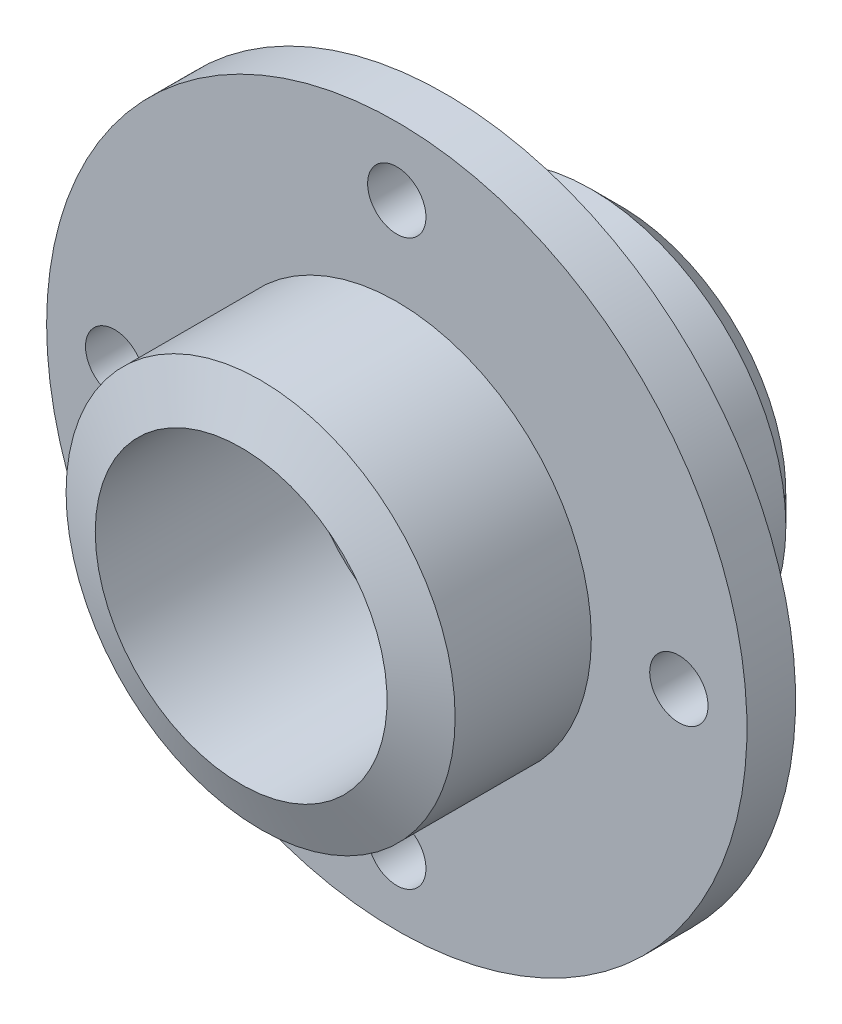
ISO-10303-21;
HEADER;
FILE_DESCRIPTION(('STEP AP214'),'2;1');
FILE_NAME('part.step','',(''),(''),'','','');
FILE_SCHEMA(('AUTOMOTIVE_DESIGN { 1 0 10303 214 1 1 1 1 }'));
ENDSEC;
DATA;
#1=APPLICATION_CONTEXT('core data for automotive mechanical design processes');
#2=APPLICATION_PROTOCOL_DEFINITION('international standard','automotive_design',2000,#1);
#3=PRODUCT_CONTEXT('',#1,'mechanical');
#4=PRODUCT('Part','Part','',(#3));
#5=PRODUCT_RELATED_PRODUCT_CATEGORY('part','',(#4));
#6=PRODUCT_DEFINITION_FORMATION('','',#4);
#7=PRODUCT_DEFINITION_CONTEXT('part definition',#1,'design');
#8=PRODUCT_DEFINITION('design','',#6,#7);
#9=PRODUCT_DEFINITION_SHAPE('','',#8);
#10=(LENGTH_UNIT() NAMED_UNIT(*) SI_UNIT(.MILLI.,.METRE.));
#11=(NAMED_UNIT(*) PLANE_ANGLE_UNIT() SI_UNIT($,.RADIAN.));
#12=(NAMED_UNIT(*) SI_UNIT($,.STERADIAN.) SOLID_ANGLE_UNIT());
#13=UNCERTAINTY_MEASURE_WITH_UNIT(LENGTH_MEASURE(1.E-05),#10,'distance_accuracy_value','');
#14=(GEOMETRIC_REPRESENTATION_CONTEXT(3) GLOBAL_UNCERTAINTY_ASSIGNED_CONTEXT((#13)) GLOBAL_UNIT_ASSIGNED_CONTEXT((#10,
#11,#12)) REPRESENTATION_CONTEXT('',''));
#15=CARTESIAN_POINT('',(0.,0.,0.));
#16=DIRECTION('',(0.,0.,1.));
#17=DIRECTION('',(1.,0.,0.));
#18=AXIS2_PLACEMENT_3D('',#15,#16,#17);
#19=CARTESIAN_POINT('',(0.,0.,-45.));
#20=DIRECTION('',(0.,0.,-1.));
#21=DIRECTION('',(-1.,0.,0.));
#22=AXIS2_PLACEMENT_3D('',#19,#20,#21);
#23=TOROIDAL_SURFACE('',#22,31.,3.);
#24=CARTESIAN_POINT('',(0.,0.,-45.));
#25=DIRECTION('',(0.,0.,-1.));
#26=DIRECTION('',(-1.,0.,0.));
#27=AXIS2_PLACEMENT_3D('',#24,#25,#26);
#28=CIRCLE('',#27,34.);
#29=CARTESIAN_POINT('',(-34.,0.,-45.));
#30=VERTEX_POINT('',#29);
#31=EDGE_CURVE('E125',#30,#30,#28,.T.);
#32=ORIENTED_EDGE('',*,*,#31,.T.);
#33=EDGE_LOOP('',(#32));
#34=FACE_BOUND('',#33,.T.);
#35=CARTESIAN_POINT('',(0.,0.,-42.));
#36=DIRECTION('',(0.,0.,-1.));
#37=DIRECTION('',(-1.,0.,0.));
#38=AXIS2_PLACEMENT_3D('',#35,#36,#37);
#39=CIRCLE('',#38,31.);
#40=CARTESIAN_POINT('',(-31.,0.,-42.));
#41=VERTEX_POINT('',#40);
#42=EDGE_CURVE('E11',#41,#41,#39,.T.);
#43=ORIENTED_EDGE('',*,*,#42,.F.);
#44=EDGE_LOOP('',(#43));
#45=FACE_BOUND('',#44,.T.);
#46=ADVANCED_FACE('F41',(#34,#45),#23,.F.);
#47=CARTESIAN_POINT('',(0.,0.,-42.));
#48=DIRECTION('',(0.,0.,-1.));
#49=DIRECTION('',(-1.,0.,0.));
#50=AXIS2_PLACEMENT_3D('',#47,#48,#49);
#51=PLANE('',#50);
#52=ORIENTED_EDGE('',*,*,#42,.T.);
#53=EDGE_LOOP('',(#52));
#54=FACE_BOUND('',#53,.T.);
#55=CARTESIAN_POINT('',(0.,0.,-42.));
#56=DIRECTION('',(0.,0.,-1.));
#57=DIRECTION('',(-1.,0.,0.));
#58=AXIS2_PLACEMENT_3D('',#55,#56,#57);
#59=CIRCLE('',#58,30.);
#60=CARTESIAN_POINT('',(-30.,0.,-42.));
#61=VERTEX_POINT('',#60);
#62=EDGE_CURVE('E48',#61,#61,#59,.T.);
#63=ORIENTED_EDGE('',*,*,#62,.F.);
#64=EDGE_LOOP('',(#63));
#65=FACE_BOUND('',#64,.T.);
#66=ADVANCED_FACE('F176',(#54,#65),#51,.T.);
#67=CARTESIAN_POINT('',(0.,0.,-115.849307742906));
#68=DIRECTION('',(0.,0.,-1.));
#69=DIRECTION('',(-1.,0.,0.));
#70=AXIS2_PLACEMENT_3D('',#67,#68,#69);
#71=CYLINDRICAL_SURFACE('',#70,30.);
#72=ORIENTED_EDGE('',*,*,#62,.T.);
#73=EDGE_LOOP('',(#72));
#74=FACE_BOUND('',#73,.T.);
#75=CARTESIAN_POINT('',(0.,0.,0.));
#76=DIRECTION('',(0.,0.,-1.));
#77=DIRECTION('',(-1.,0.,0.));
#78=AXIS2_PLACEMENT_3D('',#75,#76,#77);
#79=CIRCLE('',#78,30.);
#80=CARTESIAN_POINT('',(-30.,0.,0.));
#81=VERTEX_POINT('',#80);
#82=EDGE_CURVE('E168',#81,#81,#79,.T.);
#83=ORIENTED_EDGE('',*,*,#82,.F.);
#84=EDGE_LOOP('',(#83));
#85=FACE_BOUND('',#84,.T.);
#86=ADVANCED_FACE('F173',(#74,#85),#71,.F.);
#87=CARTESIAN_POINT('',(0.,0.,0.));
#88=DIRECTION('',(0.,0.,-1.));
#89=DIRECTION('',(-1.,0.,0.));
#90=AXIS2_PLACEMENT_3D('',#87,#88,#89);
#91=CONICAL_SURFACE('',#90,30.,1.19028994968253);
#92=CARTESIAN_POINT('',(0.,0.,-4.));
#93=DIRECTION('',(0.,0.,-1.));
#94=DIRECTION('',(-1.,0.,0.));
#95=AXIS2_PLACEMENT_3D('',#92,#93,#94);
#96=CIRCLE('',#95,40.);
#97=CARTESIAN_POINT('',(-40.,0.,-4.));
#98=VERTEX_POINT('',#97);
#99=EDGE_CURVE('E165',#98,#98,#96,.T.);
#100=ORIENTED_EDGE('',*,*,#99,.F.);
#101=EDGE_LOOP('',(#100));
#102=FACE_BOUND('',#101,.T.);
#103=ORIENTED_EDGE('',*,*,#82,.T.);
#104=EDGE_LOOP('',(#103));
#105=FACE_BOUND('',#104,.T.);
#106=ADVANCED_FACE('F183',(#102,#105),#91,.T.);
#107=CARTESIAN_POINT('',(0.,0.,-115.849307742906));
#108=DIRECTION('',(0.,0.,-1.));
#109=DIRECTION('',(-1.,0.,0.));
#110=AXIS2_PLACEMENT_3D('',#107,#108,#109);
#111=CYLINDRICAL_SURFACE('',#110,40.);
#112=CARTESIAN_POINT('',(0.,0.,-32.));
#113=DIRECTION('',(0.,0.,-1.));
#114=DIRECTION('',(-1.,0.,0.));
#115=AXIS2_PLACEMENT_3D('',#112,#113,#114);
#116=CIRCLE('',#115,40.);
#117=CARTESIAN_POINT('',(-40.,0.,-32.));
#118=VERTEX_POINT('',#117);
#119=EDGE_CURVE('E162',#118,#118,#116,.T.);
#120=ORIENTED_EDGE('',*,*,#119,.F.);
#121=EDGE_LOOP('',(#120));
#122=FACE_BOUND('',#121,.T.);
#123=ORIENTED_EDGE('',*,*,#99,.T.);
#124=EDGE_LOOP('',(#123));
#125=FACE_BOUND('',#124,.T.);
#126=ADVANCED_FACE('F189',(#122,#125),#111,.T.);
#127=CARTESIAN_POINT('',(0.,0.,-32.));
#128=DIRECTION('',(0.,0.,-1.));
#129=DIRECTION('',(-1.,0.,0.));
#130=AXIS2_PLACEMENT_3D('',#127,#128,#129);
#131=PLANE('',#130);
#132=CARTESIAN_POINT('',(-58.,0.,-32.));
#133=DIRECTION('',(0.,0.,-1.));
#134=DIRECTION('',(-1.,0.,0.));
#135=AXIS2_PLACEMENT_3D('',#132,#133,#134);
#136=CIRCLE('',#135,5.99999999999999);
#137=CARTESIAN_POINT('',(-64.,0.,-32.));
#138=VERTEX_POINT('',#137);
#139=EDGE_CURVE('E121',#138,#138,#136,.F.);
#140=ORIENTED_EDGE('',*,*,#139,.F.);
#141=EDGE_LOOP('',(#140));
#142=FACE_BOUND('',#141,.T.);
#143=CARTESIAN_POINT('',(2.03169575545132E-13,-57.9999999999998,-32.));
#144=DIRECTION('',(0.,0.,-1.));
#145=DIRECTION('',(-1.,0.,0.));
#146=AXIS2_PLACEMENT_3D('',#143,#144,#145);
#147=CIRCLE('',#146,6.00000000000019);
#148=CARTESIAN_POINT('',(-5.99999999999999,-57.9999999999998,-32.));
#149=VERTEX_POINT('',#148);
#150=EDGE_CURVE('E126',#149,#149,#147,.F.);
#151=ORIENTED_EDGE('',*,*,#150,.F.);
#152=EDGE_LOOP('',(#151));
#153=FACE_BOUND('',#152,.T.);
#154=CARTESIAN_POINT('',(58.,4.06339151090261E-13,-32.));
#155=DIRECTION('',(0.,0.,-1.));
#156=DIRECTION('',(-1.,0.,0.));
#157=AXIS2_PLACEMENT_3D('',#154,#155,#156);
#158=CIRCLE('',#157,6.);
#159=CARTESIAN_POINT('',(52.,4.06339151090261E-13,-32.));
#160=VERTEX_POINT('',#159);
#161=EDGE_CURVE('E132',#160,#160,#158,.F.);
#162=ORIENTED_EDGE('',*,*,#161,.F.);
#163=EDGE_LOOP('',(#162));
#164=FACE_BOUND('',#163,.T.);
#165=CARTESIAN_POINT('',(-6.07517752958705E-13,58.,-32.));
#166=DIRECTION('',(0.,0.,-1.));
#167=DIRECTION('',(-1.,0.,0.));
#168=AXIS2_PLACEMENT_3D('',#165,#166,#167);
#169=CIRCLE('',#168,5.99999999999998);
#170=CARTESIAN_POINT('',(-6.00000000000059,58.,-32.));
#171=VERTEX_POINT('',#170);
#172=EDGE_CURVE('E114',#171,#171,#169,.F.);
#173=ORIENTED_EDGE('',*,*,#172,.F.);
#174=EDGE_LOOP('',(#173));
#175=FACE_BOUND('',#174,.T.);
#176=CARTESIAN_POINT('',(0.,0.,-32.));
#177=DIRECTION('',(0.,0.,-1.));
#178=DIRECTION('',(-1.,0.,0.));
#179=AXIS2_PLACEMENT_3D('',#176,#177,#178);
#180=CIRCLE('',#179,72.);
#181=CARTESIAN_POINT('',(-72.,0.,-32.));
#182=VERTEX_POINT('',#181);
#183=EDGE_CURVE('E159',#182,#182,#180,.T.);
#184=ORIENTED_EDGE('',*,*,#183,.F.);
#185=EDGE_LOOP('',(#184));
#186=FACE_BOUND('',#185,.T.);
#187=ORIENTED_EDGE('',*,*,#119,.T.);
#188=EDGE_LOOP('',(#187));
#189=FACE_BOUND('',#188,.T.);
#190=ADVANCED_FACE('F193',(#142,#153,#164,#175,#186,#189),#131,.F.);
#191=CARTESIAN_POINT('',(0.,0.,-115.849307742906));
#192=DIRECTION('',(0.,0.,-1.));
#193=DIRECTION('',(-1.,0.,0.));
#194=AXIS2_PLACEMENT_3D('',#191,#192,#193);
#195=CYLINDRICAL_SURFACE('',#194,72.);
#196=ORIENTED_EDGE('',*,*,#183,.T.);
#197=EDGE_LOOP('',(#196));
#198=FACE_BOUND('',#197,.T.);
#199=CARTESIAN_POINT('',(0.,0.,-42.));
#200=DIRECTION('',(0.,0.,-1.));
#201=DIRECTION('',(-1.,0.,0.));
#202=AXIS2_PLACEMENT_3D('',#199,#200,#201);
#203=CIRCLE('',#202,72.);
#204=CARTESIAN_POINT('',(-72.,0.,-42.));
#205=VERTEX_POINT('',#204);
#206=EDGE_CURVE('E156',#205,#205,#203,.T.);
#207=ORIENTED_EDGE('',*,*,#206,.F.);
#208=EDGE_LOOP('',(#207));
#209=FACE_BOUND('',#208,.T.);
#210=ADVANCED_FACE('F197',(#198,#209),#195,.T.);
#211=CARTESIAN_POINT('',(0.,0.,-42.));
#212=DIRECTION('',(0.,0.,-1.));
#213=DIRECTION('',(-1.,0.,0.));
#214=AXIS2_PLACEMENT_3D('',#211,#212,#213);
#215=PLANE('',#214);
#216=CARTESIAN_POINT('',(-58.,0.,-42.));
#217=DIRECTION('',(0.,0.,-1.));
#218=DIRECTION('',(-1.,0.,0.));
#219=AXIS2_PLACEMENT_3D('',#216,#217,#218);
#220=CIRCLE('',#219,5.99999999999999);
#221=CARTESIAN_POINT('',(-64.,0.,-42.));
#222=VERTEX_POINT('',#221);
#223=EDGE_CURVE('E118',#222,#222,#220,.T.);
#224=ORIENTED_EDGE('',*,*,#223,.F.);
#225=EDGE_LOOP('',(#224));
#226=FACE_BOUND('',#225,.T.);
#227=CARTESIAN_POINT('',(2.03169575545132E-13,-57.9999999999998,-42.));
#228=DIRECTION('',(0.,0.,-1.));
#229=DIRECTION('',(-1.,0.,0.));
#230=AXIS2_PLACEMENT_3D('',#227,#228,#229);
#231=CIRCLE('',#230,6.00000000000019);
#232=CARTESIAN_POINT('',(-5.99999999999999,-57.9999999999998,-42.));
#233=VERTEX_POINT('',#232);
#234=EDGE_CURVE('E122',#233,#233,#231,.T.);
#235=ORIENTED_EDGE('',*,*,#234,.F.);
#236=EDGE_LOOP('',(#235));
#237=FACE_BOUND('',#236,.T.);
#238=CARTESIAN_POINT('',(58.,4.06339151090261E-13,-42.));
#239=DIRECTION('',(0.,0.,-1.));
#240=DIRECTION('',(-1.,0.,0.));
#241=AXIS2_PLACEMENT_3D('',#238,#239,#240);
#242=CIRCLE('',#241,6.);
#243=CARTESIAN_POINT('',(52.,4.06339151090261E-13,-42.));
#244=VERTEX_POINT('',#243);
#245=EDGE_CURVE('E129',#244,#244,#242,.T.);
#246=ORIENTED_EDGE('',*,*,#245,.F.);
#247=EDGE_LOOP('',(#246));
#248=FACE_BOUND('',#247,.T.);
#249=CARTESIAN_POINT('',(-6.07517752958705E-13,58.,-42.));
#250=DIRECTION('',(0.,0.,-1.));
#251=DIRECTION('',(-1.,0.,0.));
#252=AXIS2_PLACEMENT_3D('',#249,#250,#251);
#253=CIRCLE('',#252,5.99999999999998);
#254=CARTESIAN_POINT('',(-6.00000000000059,58.,-42.));
#255=VERTEX_POINT('',#254);
#256=EDGE_CURVE('E135',#255,#255,#253,.T.);
#257=ORIENTED_EDGE('',*,*,#256,.F.);
#258=EDGE_LOOP('',(#257));
#259=FACE_BOUND('',#258,.T.);
#260=ORIENTED_EDGE('',*,*,#206,.T.);
#261=EDGE_LOOP('',(#260));
#262=FACE_BOUND('',#261,.T.);
#263=CARTESIAN_POINT('',(0.,0.,-42.));
#264=DIRECTION('',(0.,0.,-1.));
#265=DIRECTION('',(-1.,0.,0.));
#266=AXIS2_PLACEMENT_3D('',#263,#264,#265);
#267=CIRCLE('',#266,40.);
#268=CARTESIAN_POINT('',(-40.,0.,-42.));
#269=VERTEX_POINT('',#268);
#270=EDGE_CURVE('E153',#269,#269,#267,.T.);
#271=ORIENTED_EDGE('',*,*,#270,.F.);
#272=EDGE_LOOP('',(#271));
#273=FACE_BOUND('',#272,.T.);
#274=ADVANCED_FACE('F201',(#226,#237,#248,#259,#262,#273),#215,.T.);
#275=CARTESIAN_POINT('',(0.,0.,-115.849307742906));
#276=DIRECTION('',(0.,0.,-1.));
#277=DIRECTION('',(-1.,0.,0.));
#278=AXIS2_PLACEMENT_3D('',#275,#276,#277);
#279=CYLINDRICAL_SURFACE('',#278,40.);
#280=CARTESIAN_POINT('',(0.,0.,-72.));
#281=DIRECTION('',(0.,0.,-1.));
#282=DIRECTION('',(-1.,0.,0.));
#283=AXIS2_PLACEMENT_3D('',#280,#281,#282);
#284=CIRCLE('',#283,40.);
#285=CARTESIAN_POINT('',(-40.,0.,-72.));
#286=VERTEX_POINT('',#285);
#287=EDGE_CURVE('E150',#286,#286,#284,.T.);
#288=ORIENTED_EDGE('',*,*,#287,.F.);
#289=EDGE_LOOP('',(#288));
#290=FACE_BOUND('',#289,.T.);
#291=ORIENTED_EDGE('',*,*,#270,.T.);
#292=EDGE_LOOP('',(#291));
#293=FACE_BOUND('',#292,.T.);
#294=ADVANCED_FACE('F205',(#290,#293),#279,.T.);
#295=CARTESIAN_POINT('',(0.,0.,-72.));
#296=DIRECTION('',(0.,0.,1.));
#297=DIRECTION('',(1.,0.,0.));
#298=AXIS2_PLACEMENT_3D('',#295,#296,#297);
#299=CONICAL_SURFACE('',#298,40.,0.785398163397448);
#300=CARTESIAN_POINT('',(0.,0.,-78.));
#301=DIRECTION('',(0.,0.,-1.));
#302=DIRECTION('',(-1.,0.,0.));
#303=AXIS2_PLACEMENT_3D('',#300,#301,#302);
#304=CIRCLE('',#303,34.);
#305=CARTESIAN_POINT('',(-34.,0.,-78.));
#306=VERTEX_POINT('',#305);
#307=EDGE_CURVE('E147',#306,#306,#304,.T.);
#308=ORIENTED_EDGE('',*,*,#307,.F.);
#309=EDGE_LOOP('',(#308));
#310=FACE_BOUND('',#309,.T.);
#311=ORIENTED_EDGE('',*,*,#287,.T.);
#312=EDGE_LOOP('',(#311));
#313=FACE_BOUND('',#312,.T.);
#314=ADVANCED_FACE('F209',(#310,#313),#299,.T.);
#315=CARTESIAN_POINT('',(0.,0.,-78.));
#316=DIRECTION('',(0.,0.,1.));
#317=DIRECTION('',(1.,0.,0.));
#318=AXIS2_PLACEMENT_3D('',#315,#316,#317);
#319=PLANE('',#318);
#320=CARTESIAN_POINT('',(0.,0.,-78.));
#321=DIRECTION('',(0.,0.,-1.));
#322=DIRECTION('',(-1.,0.,0.));
#323=AXIS2_PLACEMENT_3D('',#320,#321,#322);
#324=CIRCLE('',#323,24.);
#325=CARTESIAN_POINT('',(5.99999999999999,23.2379000772445,-78.));
#326=VERTEX_POINT('',#325);
#327=CARTESIAN_POINT('',(-6.00000000000001,23.2379000772445,-78.));
#328=VERTEX_POINT('',#327);
#329=EDGE_CURVE('E108',#326,#328,#324,.T.);
#330=ORIENTED_EDGE('',*,*,#329,.F.);
#331=DIRECTION('',(0.,-1.,0.));
#332=VECTOR('',#331,1.);
#333=CARTESIAN_POINT('',(5.99999999999999,32.,-78.));
#334=LINE('',#333,#332);
#335=CARTESIAN_POINT('',(5.99999999999999,32.,-78.));
#336=VERTEX_POINT('',#335);
#337=EDGE_CURVE('E63',#336,#326,#334,.T.);
#338=ORIENTED_EDGE('',*,*,#337,.F.);
#339=DIRECTION('',(1.,0.,0.));
#340=VECTOR('',#339,1.);
#341=CARTESIAN_POINT('',(5.99999999999999,32.,-78.));
#342=LINE('',#341,#340);
#343=CARTESIAN_POINT('',(-6.00000000000001,32.,-78.));
#344=VERTEX_POINT('',#343);
#345=EDGE_CURVE('E99',#344,#336,#342,.T.);
#346=ORIENTED_EDGE('',*,*,#345,.F.);
#347=DIRECTION('',(0.,1.,0.));
#348=VECTOR('',#347,1.);
#349=CARTESIAN_POINT('',(-6.00000000000001,32.,-78.));
#350=LINE('',#349,#348);
#351=EDGE_CURVE('E102',#328,#344,#350,.T.);
#352=ORIENTED_EDGE('',*,*,#351,.F.);
#353=EDGE_LOOP('',(#330,#338,#346,#352));
#354=FACE_BOUND('',#353,.T.);
#355=ORIENTED_EDGE('',*,*,#307,.T.);
#356=EDGE_LOOP('',(#355));
#357=FACE_BOUND('',#356,.T.);
#358=ADVANCED_FACE('F213',(#354,#357),#319,.F.);
#359=CARTESIAN_POINT('',(0.,0.,-72.));
#360=DIRECTION('',(0.,0.,1.));
#361=DIRECTION('',(1.,0.,0.));
#362=AXIS2_PLACEMENT_3D('',#359,#360,#361);
#363=PLANE('',#362);
#364=DIRECTION('',(1.,0.,0.));
#365=VECTOR('',#364,1.);
#366=CARTESIAN_POINT('',(5.99999999999999,32.,-72.));
#367=LINE('',#366,#365);
#368=CARTESIAN_POINT('',(-6.00000000000001,32.,-72.));
#369=VERTEX_POINT('',#368);
#370=CARTESIAN_POINT('',(5.99999999999999,32.,-72.));
#371=VERTEX_POINT('',#370);
#372=EDGE_CURVE('E89',#369,#371,#367,.T.);
#373=ORIENTED_EDGE('',*,*,#372,.T.);
#374=DIRECTION('',(0.,-1.,0.));
#375=VECTOR('',#374,1.);
#376=CARTESIAN_POINT('',(5.99999999999999,32.,-72.));
#377=LINE('',#376,#375);
#378=CARTESIAN_POINT('',(5.99999999999999,23.2379000772445,-72.));
#379=VERTEX_POINT('',#378);
#380=EDGE_CURVE('E83',#371,#379,#377,.T.);
#381=ORIENTED_EDGE('',*,*,#380,.T.);
#382=CARTESIAN_POINT('',(0.,0.,-72.));
#383=DIRECTION('',(0.,0.,-1.));
#384=DIRECTION('',(-1.,0.,0.));
#385=AXIS2_PLACEMENT_3D('',#382,#383,#384);
#386=CIRCLE('',#385,24.);
#387=CARTESIAN_POINT('',(-6.00000000000001,23.2379000772445,-72.));
#388=VERTEX_POINT('',#387);
#389=EDGE_CURVE('E92',#379,#388,#386,.T.);
#390=ORIENTED_EDGE('',*,*,#389,.T.);
#391=DIRECTION('',(0.,1.,0.));
#392=VECTOR('',#391,1.);
#393=CARTESIAN_POINT('',(-6.00000000000001,32.,-72.));
#394=LINE('',#393,#392);
#395=EDGE_CURVE('E55',#388,#369,#394,.T.);
#396=ORIENTED_EDGE('',*,*,#395,.T.);
#397=EDGE_LOOP('',(#373,#381,#390,#396));
#398=FACE_BOUND('',#397,.T.);
#399=CARTESIAN_POINT('',(0.,0.,-72.));
#400=DIRECTION('',(0.,0.,-1.));
#401=DIRECTION('',(-1.,0.,0.));
#402=AXIS2_PLACEMENT_3D('',#399,#400,#401);
#403=CIRCLE('',#402,34.);
#404=CARTESIAN_POINT('',(-34.,0.,-72.));
#405=VERTEX_POINT('',#404);
#406=EDGE_CURVE('E144',#405,#405,#403,.T.);
#407=ORIENTED_EDGE('',*,*,#406,.F.);
#408=EDGE_LOOP('',(#407));
#409=FACE_BOUND('',#408,.T.);
#410=ADVANCED_FACE('F96',(#398,#409),#363,.T.);
#411=CARTESIAN_POINT('',(0.,0.,-115.849307742906));
#412=DIRECTION('',(0.,0.,-1.));
#413=DIRECTION('',(-1.,0.,0.));
#414=AXIS2_PLACEMENT_3D('',#411,#412,#413);
#415=CYLINDRICAL_SURFACE('',#414,34.);
#416=ORIENTED_EDGE('',*,*,#31,.F.);
#417=EDGE_LOOP('',(#416));
#418=FACE_BOUND('',#417,.T.);
#419=ORIENTED_EDGE('',*,*,#406,.T.);
#420=EDGE_LOOP('',(#419));
#421=FACE_BOUND('',#420,.T.);
#422=ADVANCED_FACE('F220',(#418,#421),#415,.F.);
#423=CARTESIAN_POINT('',(-6.07517752958705E-13,58.,-15.0294372515223));
#424=DIRECTION('',(0.,0.,-1.));
#425=DIRECTION('',(-1.,0.,0.));
#426=AXIS2_PLACEMENT_3D('',#423,#424,#425);
#427=CYLINDRICAL_SURFACE('',#426,5.99999999999998);
#428=ORIENTED_EDGE('',*,*,#172,.T.);
#429=EDGE_LOOP('',(#428));
#430=FACE_BOUND('',#429,.T.);
#431=ORIENTED_EDGE('',*,*,#256,.T.);
#432=EDGE_LOOP('',(#431));
#433=FACE_BOUND('',#432,.T.);
#434=ADVANCED_FACE('F223',(#430,#433),#427,.F.);
#435=CARTESIAN_POINT('',(58.,4.06339151090261E-13,-15.0294372515223));
#436=DIRECTION('',(0.,0.,-1.));
#437=DIRECTION('',(-1.,0.,0.));
#438=AXIS2_PLACEMENT_3D('',#435,#436,#437);
#439=CYLINDRICAL_SURFACE('',#438,6.);
#440=ORIENTED_EDGE('',*,*,#161,.T.);
#441=EDGE_LOOP('',(#440));
#442=FACE_BOUND('',#441,.T.);
#443=ORIENTED_EDGE('',*,*,#245,.T.);
#444=EDGE_LOOP('',(#443));
#445=FACE_BOUND('',#444,.T.);
#446=ADVANCED_FACE('F227',(#442,#445),#439,.F.);
#447=CARTESIAN_POINT('',(2.03169575545132E-13,-57.9999999999998,-15.0294372515223));
#448=DIRECTION('',(0.,0.,-1.));
#449=DIRECTION('',(-1.,0.,0.));
#450=AXIS2_PLACEMENT_3D('',#447,#448,#449);
#451=CYLINDRICAL_SURFACE('',#450,6.00000000000019);
#452=ORIENTED_EDGE('',*,*,#150,.T.);
#453=EDGE_LOOP('',(#452));
#454=FACE_BOUND('',#453,.T.);
#455=ORIENTED_EDGE('',*,*,#234,.T.);
#456=EDGE_LOOP('',(#455));
#457=FACE_BOUND('',#456,.T.);
#458=ADVANCED_FACE('F231',(#454,#457),#451,.F.);
#459=CARTESIAN_POINT('',(-58.,0.,-15.0294372515223));
#460=DIRECTION('',(0.,0.,-1.));
#461=DIRECTION('',(-1.,0.,0.));
#462=AXIS2_PLACEMENT_3D('',#459,#460,#461);
#463=CYLINDRICAL_SURFACE('',#462,5.99999999999999);
#464=ORIENTED_EDGE('',*,*,#139,.T.);
#465=EDGE_LOOP('',(#464));
#466=FACE_BOUND('',#465,.T.);
#467=ORIENTED_EDGE('',*,*,#223,.T.);
#468=EDGE_LOOP('',(#467));
#469=FACE_BOUND('',#468,.T.);
#470=ADVANCED_FACE('F235',(#466,#469),#463,.F.);
#471=CARTESIAN_POINT('',(5.99999999999999,32.,-72.));
#472=DIRECTION('',(1.,0.,0.));
#473=DIRECTION('',(0.,1.,0.));
#474=AXIS2_PLACEMENT_3D('',#471,#472,#473);
#475=PLANE('',#474);
#476=ORIENTED_EDGE('',*,*,#337,.T.);
#477=DIRECTION('',(0.,0.,-1.));
#478=VECTOR('',#477,1.);
#479=CARTESIAN_POINT('',(5.99999999999999,23.2379000772445,-72.));
#480=LINE('',#479,#478);
#481=EDGE_CURVE('E79',#379,#326,#480,.T.);
#482=ORIENTED_EDGE('',*,*,#481,.F.);
#483=ORIENTED_EDGE('',*,*,#380,.F.);
#484=DIRECTION('',(0.,0.,-1.));
#485=VECTOR('',#484,1.);
#486=CARTESIAN_POINT('',(5.99999999999999,32.,-72.));
#487=LINE('',#486,#485);
#488=EDGE_CURVE('E112',#371,#336,#487,.T.);
#489=ORIENTED_EDGE('',*,*,#488,.T.);
#490=EDGE_LOOP('',(#476,#482,#483,#489));
#491=FACE_BOUND('',#490,.T.);
#492=ADVANCED_FACE('F81',(#491),#475,.F.);
#493=CARTESIAN_POINT('',(5.99999999999999,32.,-72.));
#494=DIRECTION('',(0.,1.,0.));
#495=DIRECTION('',(0.,0.,1.));
#496=AXIS2_PLACEMENT_3D('',#493,#494,#495);
#497=PLANE('',#496);
#498=ORIENTED_EDGE('',*,*,#345,.T.);
#499=ORIENTED_EDGE('',*,*,#488,.F.);
#500=ORIENTED_EDGE('',*,*,#372,.F.);
#501=DIRECTION('',(0.,0.,-1.));
#502=VECTOR('',#501,1.);
#503=CARTESIAN_POINT('',(-6.00000000000001,32.,-72.));
#504=LINE('',#503,#502);
#505=EDGE_CURVE('E115',#369,#344,#504,.T.);
#506=ORIENTED_EDGE('',*,*,#505,.T.);
#507=EDGE_LOOP('',(#498,#499,#500,#506));
#508=FACE_BOUND('',#507,.T.);
#509=ADVANCED_FACE('F242',(#508),#497,.F.);
#510=CARTESIAN_POINT('',(-6.00000000000001,32.,-72.));
#511=DIRECTION('',(-1.,0.,0.));
#512=DIRECTION('',(0.,0.,1.));
#513=AXIS2_PLACEMENT_3D('',#510,#511,#512);
#514=PLANE('',#513);
#515=ORIENTED_EDGE('',*,*,#351,.T.);
#516=ORIENTED_EDGE('',*,*,#505,.F.);
#517=ORIENTED_EDGE('',*,*,#395,.F.);
#518=DIRECTION('',(0.,0.,-1.));
#519=VECTOR('',#518,1.);
#520=CARTESIAN_POINT('',(-6.00000000000001,23.2379000772445,-72.));
#521=LINE('',#520,#519);
#522=EDGE_CURVE('E88',#388,#328,#521,.T.);
#523=ORIENTED_EDGE('',*,*,#522,.T.);
#524=EDGE_LOOP('',(#515,#516,#517,#523));
#525=FACE_BOUND('',#524,.T.);
#526=ADVANCED_FACE('F245',(#525),#514,.F.);
#527=CARTESIAN_POINT('',(0.,0.,-72.));
#528=DIRECTION('',(0.,0.,-1.));
#529=DIRECTION('',(-1.,0.,0.));
#530=AXIS2_PLACEMENT_3D('',#527,#528,#529);
#531=CYLINDRICAL_SURFACE('',#530,24.);
#532=ORIENTED_EDGE('',*,*,#329,.T.);
#533=ORIENTED_EDGE('',*,*,#522,.F.);
#534=ORIENTED_EDGE('',*,*,#389,.F.);
#535=ORIENTED_EDGE('',*,*,#481,.T.);
#536=EDGE_LOOP('',(#532,#533,#534,#535));
#537=FACE_BOUND('',#536,.T.);
#538=ADVANCED_FACE('F93',(#537),#531,.F.);
#539=CLOSED_SHELL('',(#46,#66,#86,#106,#126,#190,#210,#274,#294,#314,#358,#410,#422,#434,#446,
#458,#470,#492,#509,#526,#538));
#540=MANIFOLD_SOLID_BREP('B2',#539);
#541=ADVANCED_BREP_SHAPE_REPRESENTATION('',(#18,#540),#14);
#542=SHAPE_DEFINITION_REPRESENTATION(#9,#541);
ENDSEC;
END-ISO-10303-21;
